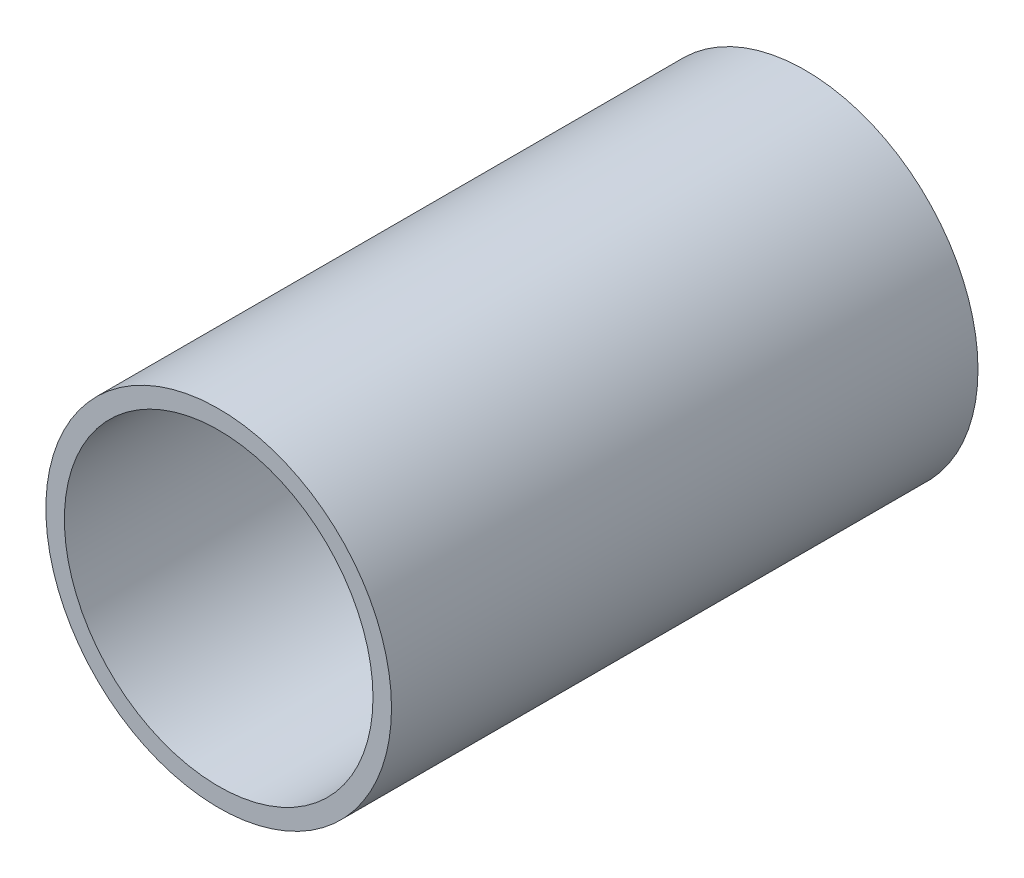
ISO-10303-21;
HEADER;
FILE_DESCRIPTION(('STEP AP214'),'2;1');
FILE_NAME('part.step','',(''),(''),'','','');
FILE_SCHEMA(('AUTOMOTIVE_DESIGN { 1 0 10303 214 1 1 1 1 }'));
ENDSEC;
DATA;
#1=APPLICATION_CONTEXT('core data for automotive mechanical design processes');
#2=APPLICATION_PROTOCOL_DEFINITION('international standard','automotive_design',2000,#1);
#3=PRODUCT_CONTEXT('',#1,'mechanical');
#4=PRODUCT('Part','Part','',(#3));
#5=PRODUCT_RELATED_PRODUCT_CATEGORY('part','',(#4));
#6=PRODUCT_DEFINITION_FORMATION('','',#4);
#7=PRODUCT_DEFINITION_CONTEXT('part definition',#1,'design');
#8=PRODUCT_DEFINITION('design','',#6,#7);
#9=PRODUCT_DEFINITION_SHAPE('','',#8);
#10=(LENGTH_UNIT() NAMED_UNIT(*) SI_UNIT(.MILLI.,.METRE.));
#11=(NAMED_UNIT(*) PLANE_ANGLE_UNIT() SI_UNIT($,.RADIAN.));
#12=(NAMED_UNIT(*) SI_UNIT($,.STERADIAN.) SOLID_ANGLE_UNIT());
#13=UNCERTAINTY_MEASURE_WITH_UNIT(LENGTH_MEASURE(1.E-05),#10,'distance_accuracy_value','');
#14=(GEOMETRIC_REPRESENTATION_CONTEXT(3) GLOBAL_UNCERTAINTY_ASSIGNED_CONTEXT((#13)) GLOBAL_UNIT_ASSIGNED_CONTEXT((#10,
#11,#12)) REPRESENTATION_CONTEXT('',''));
#15=CARTESIAN_POINT('',(0.,0.,0.));
#16=DIRECTION('',(0.,0.,1.));
#17=DIRECTION('',(1.,0.,0.));
#18=AXIS2_PLACEMENT_3D('',#15,#16,#17);
#19=CARTESIAN_POINT('',(0.,0.,95.));
#20=DIRECTION('',(0.,0.,-1.));
#21=DIRECTION('',(-1.,0.,0.));
#22=AXIS2_PLACEMENT_3D('',#19,#20,#21);
#23=CYLINDRICAL_SURFACE('',#22,27.9943440175555);
#24=CARTESIAN_POINT('',(0.,0.,95.));
#25=DIRECTION('',(0.,0.,1.));
#26=DIRECTION('',(1.,0.,0.));
#27=AXIS2_PLACEMENT_3D('',#24,#25,#26);
#28=CIRCLE('',#27,27.9943440175555);
#29=CARTESIAN_POINT('',(27.9943440175555,0.,95.));
#30=VERTEX_POINT('',#29);
#31=EDGE_CURVE('E10',#30,#30,#28,.T.);
#32=ORIENTED_EDGE('',*,*,#31,.F.);
#33=EDGE_LOOP('',(#32));
#34=FACE_BOUND('',#33,.T.);
#35=CARTESIAN_POINT('',(0.,0.,0.));
#36=DIRECTION('',(0.,0.,1.));
#37=DIRECTION('',(1.,0.,0.));
#38=AXIS2_PLACEMENT_3D('',#35,#36,#37);
#39=CIRCLE('',#38,27.9943440175555);
#40=CARTESIAN_POINT('',(27.9943440175555,0.,0.));
#41=VERTEX_POINT('',#40);
#42=EDGE_CURVE('E34',#41,#41,#39,.T.);
#43=ORIENTED_EDGE('',*,*,#42,.T.);
#44=EDGE_LOOP('',(#43));
#45=FACE_BOUND('',#44,.T.);
#46=ADVANCED_FACE('F31',(#34,#45),#23,.T.);
#47=CARTESIAN_POINT('',(0.,0.,95.));
#48=DIRECTION('',(0.,0.,1.));
#49=DIRECTION('',(1.,0.,0.));
#50=AXIS2_PLACEMENT_3D('',#47,#48,#49);
#51=PLANE('',#50);
#52=CARTESIAN_POINT('',(0.,0.,95.));
#53=DIRECTION('',(0.,0.,1.));
#54=DIRECTION('',(1.,0.,0.));
#55=AXIS2_PLACEMENT_3D('',#52,#53,#54);
#56=CIRCLE('',#55,24.9943440175555);
#57=CARTESIAN_POINT('',(24.9943440175555,0.,95.));
#58=VERTEX_POINT('',#57);
#59=EDGE_CURVE('E43',#58,#58,#56,.T.);
#60=ORIENTED_EDGE('',*,*,#59,.F.);
#61=EDGE_LOOP('',(#60));
#62=FACE_BOUND('',#61,.T.);
#63=ORIENTED_EDGE('',*,*,#31,.T.);
#64=EDGE_LOOP('',(#63));
#65=FACE_BOUND('',#64,.T.);
#66=ADVANCED_FACE('F58',(#62,#65),#51,.T.);
#67=CARTESIAN_POINT('',(0.,0.,0.));
#68=DIRECTION('',(0.,0.,1.));
#69=DIRECTION('',(1.,0.,0.));
#70=AXIS2_PLACEMENT_3D('',#67,#68,#69);
#71=PLANE('',#70);
#72=ORIENTED_EDGE('',*,*,#42,.F.);
#73=EDGE_LOOP('',(#72));
#74=FACE_BOUND('',#73,.T.);
#75=ADVANCED_FACE('F54',(#74),#71,.F.);
#76=CARTESIAN_POINT('',(0.,0.,15.));
#77=DIRECTION('',(0.,0.,1.));
#78=DIRECTION('',(1.,0.,0.));
#79=AXIS2_PLACEMENT_3D('',#76,#77,#78);
#80=CYLINDRICAL_SURFACE('',#79,24.9943440175555);
#81=CARTESIAN_POINT('',(0.,0.,15.));
#82=DIRECTION('',(0.,0.,1.));
#83=DIRECTION('',(1.,0.,0.));
#84=AXIS2_PLACEMENT_3D('',#81,#82,#83);
#85=CIRCLE('',#84,24.9943440175555);
#86=CARTESIAN_POINT('',(24.9943440175555,0.,15.));
#87=VERTEX_POINT('',#86);
#88=EDGE_CURVE('E41',#87,#87,#85,.T.);
#89=ORIENTED_EDGE('',*,*,#88,.F.);
#90=EDGE_LOOP('',(#89));
#91=FACE_BOUND('',#90,.T.);
#92=ORIENTED_EDGE('',*,*,#59,.T.);
#93=EDGE_LOOP('',(#92));
#94=FACE_BOUND('',#93,.T.);
#95=ADVANCED_FACE('F51',(#91,#94),#80,.F.);
#96=CARTESIAN_POINT('',(0.,0.,15.));
#97=DIRECTION('',(0.,0.,1.));
#98=DIRECTION('',(1.,0.,0.));
#99=AXIS2_PLACEMENT_3D('',#96,#97,#98);
#100=PLANE('',#99);
#101=ORIENTED_EDGE('',*,*,#88,.T.);
#102=EDGE_LOOP('',(#101));
#103=FACE_BOUND('',#102,.T.);
#104=ADVANCED_FACE('F49',(#103),#100,.T.);
#105=CLOSED_SHELL('',(#46,#66,#75,#95,#104));
#106=MANIFOLD_SOLID_BREP('B2',#105);
#107=ADVANCED_BREP_SHAPE_REPRESENTATION('',(#18,#106),#14);
#108=SHAPE_DEFINITION_REPRESENTATION(#9,#107);
ENDSEC;
END-ISO-10303-21;
